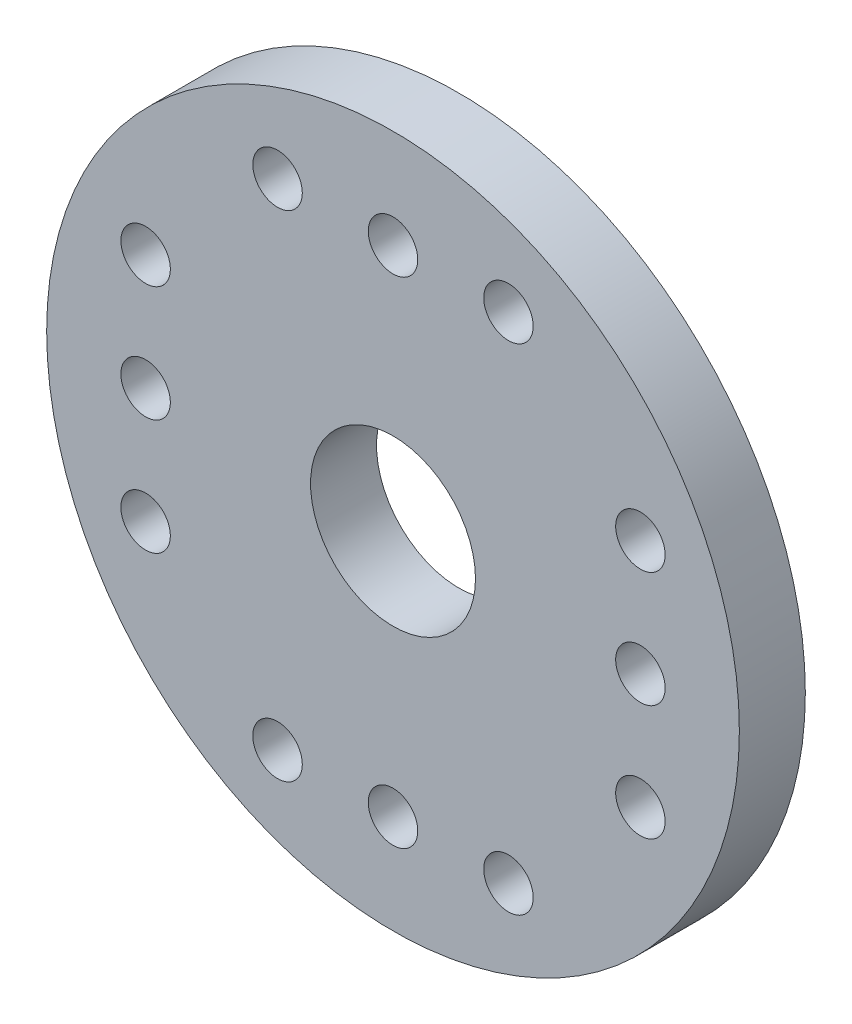
ISO-10303-21;
HEADER;
FILE_DESCRIPTION(('STEP AP214'),'2;1');
FILE_NAME('part.step','',(''),(''),'','','');
FILE_SCHEMA(('AUTOMOTIVE_DESIGN { 1 0 10303 214 1 1 1 1 }'));
ENDSEC;
DATA;
#1=APPLICATION_CONTEXT('core data for automotive mechanical design processes');
#2=APPLICATION_PROTOCOL_DEFINITION('international standard','automotive_design',2000,#1);
#3=PRODUCT_CONTEXT('',#1,'mechanical');
#4=PRODUCT('Part','Part','',(#3));
#5=PRODUCT_RELATED_PRODUCT_CATEGORY('part','',(#4));
#6=PRODUCT_DEFINITION_FORMATION('','',#4);
#7=PRODUCT_DEFINITION_CONTEXT('part definition',#1,'design');
#8=PRODUCT_DEFINITION('design','',#6,#7);
#9=PRODUCT_DEFINITION_SHAPE('','',#8);
#10=(LENGTH_UNIT() NAMED_UNIT(*) SI_UNIT(.MILLI.,.METRE.));
#11=(NAMED_UNIT(*) PLANE_ANGLE_UNIT() SI_UNIT($,.RADIAN.));
#12=(NAMED_UNIT(*) SI_UNIT($,.STERADIAN.) SOLID_ANGLE_UNIT());
#13=UNCERTAINTY_MEASURE_WITH_UNIT(LENGTH_MEASURE(1.E-05),#10,'distance_accuracy_value','');
#14=(GEOMETRIC_REPRESENTATION_CONTEXT(3) GLOBAL_UNCERTAINTY_ASSIGNED_CONTEXT((#13)) GLOBAL_UNIT_ASSIGNED_CONTEXT((#10,
#11,#12)) REPRESENTATION_CONTEXT('',''));
#15=CARTESIAN_POINT('',(0.,0.,0.));
#16=DIRECTION('',(0.,0.,1.));
#17=DIRECTION('',(1.,0.,0.));
#18=AXIS2_PLACEMENT_3D('',#15,#16,#17);
#19=CARTESIAN_POINT('',(0.,0.,2.));
#20=DIRECTION('',(0.,0.,1.));
#21=DIRECTION('',(1.,0.,0.));
#22=AXIS2_PLACEMENT_3D('',#19,#20,#21);
#23=PLANE('',#22);
#24=CARTESIAN_POINT('',(-7.49999999999926,-3.50000000000054,2.));
#25=DIRECTION('',(0.,0.,1.));
#26=DIRECTION('',(1.,0.,0.));
#27=AXIS2_PLACEMENT_3D('',#24,#25,#26);
#28=CIRCLE('',#27,0.750000000000818);
#29=CARTESIAN_POINT('',(-6.74999999999844,-3.50000000000054,2.));
#30=VERTEX_POINT('',#29);
#31=EDGE_CURVE('E107',#30,#30,#28,.T.);
#32=ORIENTED_EDGE('',*,*,#31,.F.);
#33=EDGE_LOOP('',(#32));
#34=FACE_BOUND('',#33,.T.);
#35=CARTESIAN_POINT('',(-3.49999999999872,-7.4999999999998,2.));
#36=DIRECTION('',(0.,0.,1.));
#37=DIRECTION('',(1.,0.,0.));
#38=AXIS2_PLACEMENT_3D('',#35,#36,#37);
#39=CIRCLE('',#38,0.750000000001322);
#40=CARTESIAN_POINT('',(-2.7499999999974,-7.4999999999998,2.));
#41=VERTEX_POINT('',#40);
#42=EDGE_CURVE('E95',#41,#41,#39,.T.);
#43=ORIENTED_EDGE('',*,*,#42,.F.);
#44=EDGE_LOOP('',(#43));
#45=FACE_BOUND('',#44,.T.);
#46=CARTESIAN_POINT('',(1.27714004517142E-12,-7.4999999999998,2.));
#47=DIRECTION('',(0.,0.,1.));
#48=DIRECTION('',(1.,0.,0.));
#49=AXIS2_PLACEMENT_3D('',#46,#47,#48);
#50=CIRCLE('',#49,0.750000000001329);
#51=CARTESIAN_POINT('',(0.750000000002606,-7.4999999999998,2.));
#52=VERTEX_POINT('',#51);
#53=EDGE_CURVE('E83',#52,#52,#50,.T.);
#54=ORIENTED_EDGE('',*,*,#53,.F.);
#55=EDGE_LOOP('',(#54));
#56=FACE_BOUND('',#55,.T.);
#57=CARTESIAN_POINT('',(7.50000000000054,3.50000000000074,2.));
#58=DIRECTION('',(0.,0.,1.));
#59=DIRECTION('',(1.,0.,0.));
#60=AXIS2_PLACEMENT_3D('',#57,#58,#59);
#61=CIRCLE('',#60,0.750000000000576);
#62=CARTESIAN_POINT('',(8.25000000000111,3.50000000000074,2.));
#63=VERTEX_POINT('',#62);
#64=EDGE_CURVE('E71',#63,#63,#61,.T.);
#65=ORIENTED_EDGE('',*,*,#64,.F.);
#66=EDGE_LOOP('',(#65));
#67=FACE_BOUND('',#66,.T.);
#68=CARTESIAN_POINT('',(0.,0.,2.));
#69=DIRECTION('',(0.,0.,1.));
#70=DIRECTION('',(1.,0.,0.));
#71=AXIS2_PLACEMENT_3D('',#68,#69,#70);
#72=CIRCLE('',#71,2.5);
#73=CARTESIAN_POINT('',(2.5,0.,2.));
#74=VERTEX_POINT('',#73);
#75=EDGE_CURVE('E59',#74,#74,#72,.T.);
#76=ORIENTED_EDGE('',*,*,#75,.F.);
#77=EDGE_LOOP('',(#76));
#78=FACE_BOUND('',#77,.T.);
#79=CARTESIAN_POINT('',(-3.5,7.5,2.));
#80=DIRECTION('',(0.,0.,1.));
#81=DIRECTION('',(1.,0.,0.));
#82=AXIS2_PLACEMENT_3D('',#79,#80,#81);
#83=CIRCLE('',#82,0.75);
#84=CARTESIAN_POINT('',(-2.75,7.5,2.));
#85=VERTEX_POINT('',#84);
#86=EDGE_CURVE('E47',#85,#85,#83,.T.);
#87=ORIENTED_EDGE('',*,*,#86,.F.);
#88=EDGE_LOOP('',(#87));
#89=FACE_BOUND('',#88,.T.);
#90=CARTESIAN_POINT('',(0.,0.,2.));
#91=DIRECTION('',(0.,0.,1.));
#92=DIRECTION('',(1.,0.,0.));
#93=AXIS2_PLACEMENT_3D('',#90,#91,#92);
#94=CIRCLE('',#93,10.5);
#95=CARTESIAN_POINT('',(10.5,0.,2.));
#96=VERTEX_POINT('',#95);
#97=EDGE_CURVE('E10',#96,#96,#94,.T.);
#98=ORIENTED_EDGE('',*,*,#97,.T.);
#99=EDGE_LOOP('',(#98));
#100=FACE_BOUND('',#99,.T.);
#101=CARTESIAN_POINT('',(0.,7.5,2.));
#102=DIRECTION('',(0.,0.,1.));
#103=DIRECTION('',(1.,0.,0.));
#104=AXIS2_PLACEMENT_3D('',#101,#102,#103);
#105=CIRCLE('',#104,0.75);
#106=CARTESIAN_POINT('',(0.75,7.5,2.));
#107=VERTEX_POINT('',#106);
#108=EDGE_CURVE('E42',#107,#107,#105,.T.);
#109=ORIENTED_EDGE('',*,*,#108,.F.);
#110=EDGE_LOOP('',(#109));
#111=FACE_BOUND('',#110,.T.);
#112=CARTESIAN_POINT('',(3.5,7.5,2.));
#113=DIRECTION('',(0.,0.,1.));
#114=DIRECTION('',(1.,0.,0.));
#115=AXIS2_PLACEMENT_3D('',#112,#113,#114);
#116=CIRCLE('',#115,0.75);
#117=CARTESIAN_POINT('',(4.25,7.5,2.));
#118=VERTEX_POINT('',#117);
#119=EDGE_CURVE('E53',#118,#118,#116,.T.);
#120=ORIENTED_EDGE('',*,*,#119,.F.);
#121=EDGE_LOOP('',(#120));
#122=FACE_BOUND('',#121,.T.);
#123=CARTESIAN_POINT('',(7.50000000000054,7.3744926071639E-13,2.));
#124=DIRECTION('',(0.,0.,1.));
#125=DIRECTION('',(1.,0.,0.));
#126=AXIS2_PLACEMENT_3D('',#123,#124,#125);
#127=CIRCLE('',#126,0.750000000000573);
#128=CARTESIAN_POINT('',(8.25000000000111,7.3744926071639E-13,2.));
#129=VERTEX_POINT('',#128);
#130=EDGE_CURVE('E65',#129,#129,#127,.T.);
#131=ORIENTED_EDGE('',*,*,#130,.F.);
#132=EDGE_LOOP('',(#131));
#133=FACE_BOUND('',#132,.T.);
#134=CARTESIAN_POINT('',(7.50000000000054,-3.49999999999926,2.));
#135=DIRECTION('',(0.,0.,1.));
#136=DIRECTION('',(1.,0.,0.));
#137=AXIS2_PLACEMENT_3D('',#134,#135,#136);
#138=CIRCLE('',#137,0.750000000000569);
#139=CARTESIAN_POINT('',(8.25000000000111,-3.49999999999926,2.));
#140=VERTEX_POINT('',#139);
#141=EDGE_CURVE('E77',#140,#140,#138,.T.);
#142=ORIENTED_EDGE('',*,*,#141,.F.);
#143=EDGE_LOOP('',(#142));
#144=FACE_BOUND('',#143,.T.);
#145=CARTESIAN_POINT('',(3.50000000000128,-7.4999999999998,2.));
#146=DIRECTION('',(0.,0.,1.));
#147=DIRECTION('',(1.,0.,0.));
#148=AXIS2_PLACEMENT_3D('',#145,#146,#147);
#149=CIRCLE('',#148,0.750000000001336);
#150=CARTESIAN_POINT('',(4.25000000000261,-7.4999999999998,2.));
#151=VERTEX_POINT('',#150);
#152=EDGE_CURVE('E89',#151,#151,#149,.T.);
#153=ORIENTED_EDGE('',*,*,#152,.F.);
#154=EDGE_LOOP('',(#153));
#155=FACE_BOUND('',#154,.T.);
#156=CARTESIAN_POINT('',(-7.49999999999926,-5.40609269554394E-13,2.));
#157=DIRECTION('',(0.,0.,1.));
#158=DIRECTION('',(1.,0.,0.));
#159=AXIS2_PLACEMENT_3D('',#156,#157,#158);
#160=CIRCLE('',#159,0.750000000000808);
#161=CARTESIAN_POINT('',(-6.74999999999846,-5.40609269554394E-13,2.));
#162=VERTEX_POINT('',#161);
#163=EDGE_CURVE('E101',#162,#162,#160,.T.);
#164=ORIENTED_EDGE('',*,*,#163,.F.);
#165=EDGE_LOOP('',(#164));
#166=FACE_BOUND('',#165,.T.);
#167=CARTESIAN_POINT('',(-7.49999999999926,3.49999999999946,2.));
#168=DIRECTION('',(0.,0.,1.));
#169=DIRECTION('',(1.,0.,0.));
#170=AXIS2_PLACEMENT_3D('',#167,#168,#169);
#171=CIRCLE('',#170,0.750000000000797);
#172=CARTESIAN_POINT('',(-6.74999999999847,3.49999999999946,2.));
#173=VERTEX_POINT('',#172);
#174=EDGE_CURVE('E113',#173,#173,#171,.T.);
#175=ORIENTED_EDGE('',*,*,#174,.F.);
#176=EDGE_LOOP('',(#175));
#177=FACE_BOUND('',#176,.T.);
#178=ADVANCED_FACE('F31',(#34,#45,#56,#67,#78,#89,#100,#111,#122,#133,#144,#155,#166,#177),#23,.T.);
#179=CARTESIAN_POINT('',(0.,0.,0.));
#180=DIRECTION('',(0.,0.,1.));
#181=DIRECTION('',(1.,0.,0.));
#182=AXIS2_PLACEMENT_3D('',#179,#180,#181);
#183=PLANE('',#182);
#184=CARTESIAN_POINT('',(-7.49999999999926,-3.50000000000054,0.));
#185=DIRECTION('',(0.,0.,1.));
#186=DIRECTION('',(1.,0.,0.));
#187=AXIS2_PLACEMENT_3D('',#184,#185,#186);
#188=CIRCLE('',#187,0.750000000000818);
#189=CARTESIAN_POINT('',(-6.74999999999844,-3.50000000000054,0.));
#190=VERTEX_POINT('',#189);
#191=EDGE_CURVE('E110',#190,#190,#188,.T.);
#192=ORIENTED_EDGE('',*,*,#191,.T.);
#193=EDGE_LOOP('',(#192));
#194=FACE_BOUND('',#193,.T.);
#195=CARTESIAN_POINT('',(-3.49999999999872,-7.4999999999998,0.));
#196=DIRECTION('',(0.,0.,1.));
#197=DIRECTION('',(1.,0.,0.));
#198=AXIS2_PLACEMENT_3D('',#195,#196,#197);
#199=CIRCLE('',#198,0.750000000001322);
#200=CARTESIAN_POINT('',(-2.7499999999974,-7.4999999999998,0.));
#201=VERTEX_POINT('',#200);
#202=EDGE_CURVE('E98',#201,#201,#199,.T.);
#203=ORIENTED_EDGE('',*,*,#202,.T.);
#204=EDGE_LOOP('',(#203));
#205=FACE_BOUND('',#204,.T.);
#206=CARTESIAN_POINT('',(1.27714004517142E-12,-7.4999999999998,0.));
#207=DIRECTION('',(0.,0.,1.));
#208=DIRECTION('',(1.,0.,0.));
#209=AXIS2_PLACEMENT_3D('',#206,#207,#208);
#210=CIRCLE('',#209,0.750000000001329);
#211=CARTESIAN_POINT('',(0.750000000002606,-7.4999999999998,0.));
#212=VERTEX_POINT('',#211);
#213=EDGE_CURVE('E86',#212,#212,#210,.T.);
#214=ORIENTED_EDGE('',*,*,#213,.T.);
#215=EDGE_LOOP('',(#214));
#216=FACE_BOUND('',#215,.T.);
#217=CARTESIAN_POINT('',(7.50000000000054,3.50000000000074,0.));
#218=DIRECTION('',(0.,0.,1.));
#219=DIRECTION('',(1.,0.,0.));
#220=AXIS2_PLACEMENT_3D('',#217,#218,#219);
#221=CIRCLE('',#220,0.750000000000576);
#222=CARTESIAN_POINT('',(8.25000000000111,3.50000000000074,0.));
#223=VERTEX_POINT('',#222);
#224=EDGE_CURVE('E74',#223,#223,#221,.T.);
#225=ORIENTED_EDGE('',*,*,#224,.T.);
#226=EDGE_LOOP('',(#225));
#227=FACE_BOUND('',#226,.T.);
#228=CARTESIAN_POINT('',(0.,0.,0.));
#229=DIRECTION('',(0.,0.,1.));
#230=DIRECTION('',(1.,0.,0.));
#231=AXIS2_PLACEMENT_3D('',#228,#229,#230);
#232=CIRCLE('',#231,2.5);
#233=CARTESIAN_POINT('',(2.5,0.,0.));
#234=VERTEX_POINT('',#233);
#235=EDGE_CURVE('E62',#234,#234,#232,.T.);
#236=ORIENTED_EDGE('',*,*,#235,.T.);
#237=EDGE_LOOP('',(#236));
#238=FACE_BOUND('',#237,.T.);
#239=CARTESIAN_POINT('',(-3.5,7.5,0.));
#240=DIRECTION('',(0.,0.,1.));
#241=DIRECTION('',(1.,0.,0.));
#242=AXIS2_PLACEMENT_3D('',#239,#240,#241);
#243=CIRCLE('',#242,0.75);
#244=CARTESIAN_POINT('',(-2.75,7.5,0.));
#245=VERTEX_POINT('',#244);
#246=EDGE_CURVE('E50',#245,#245,#243,.T.);
#247=ORIENTED_EDGE('',*,*,#246,.T.);
#248=EDGE_LOOP('',(#247));
#249=FACE_BOUND('',#248,.T.);
#250=CARTESIAN_POINT('',(0.,0.,0.));
#251=DIRECTION('',(0.,0.,1.));
#252=DIRECTION('',(1.,0.,0.));
#253=AXIS2_PLACEMENT_3D('',#250,#251,#252);
#254=CIRCLE('',#253,10.5);
#255=CARTESIAN_POINT('',(10.5,0.,0.));
#256=VERTEX_POINT('',#255);
#257=EDGE_CURVE('E35',#256,#256,#254,.T.);
#258=ORIENTED_EDGE('',*,*,#257,.F.);
#259=EDGE_LOOP('',(#258));
#260=FACE_BOUND('',#259,.T.);
#261=CARTESIAN_POINT('',(0.,7.5,0.));
#262=DIRECTION('',(0.,0.,1.));
#263=DIRECTION('',(1.,0.,0.));
#264=AXIS2_PLACEMENT_3D('',#261,#262,#263);
#265=CIRCLE('',#264,0.75);
#266=CARTESIAN_POINT('',(0.75,7.5,0.));
#267=VERTEX_POINT('',#266);
#268=EDGE_CURVE('E44',#267,#267,#265,.T.);
#269=ORIENTED_EDGE('',*,*,#268,.T.);
#270=EDGE_LOOP('',(#269));
#271=FACE_BOUND('',#270,.T.);
#272=CARTESIAN_POINT('',(3.5,7.5,0.));
#273=DIRECTION('',(0.,0.,1.));
#274=DIRECTION('',(1.,0.,0.));
#275=AXIS2_PLACEMENT_3D('',#272,#273,#274);
#276=CIRCLE('',#275,0.75);
#277=CARTESIAN_POINT('',(4.25,7.5,0.));
#278=VERTEX_POINT('',#277);
#279=EDGE_CURVE('E56',#278,#278,#276,.T.);
#280=ORIENTED_EDGE('',*,*,#279,.T.);
#281=EDGE_LOOP('',(#280));
#282=FACE_BOUND('',#281,.T.);
#283=CARTESIAN_POINT('',(7.50000000000054,7.3744926071639E-13,0.));
#284=DIRECTION('',(0.,0.,1.));
#285=DIRECTION('',(1.,0.,0.));
#286=AXIS2_PLACEMENT_3D('',#283,#284,#285);
#287=CIRCLE('',#286,0.750000000000573);
#288=CARTESIAN_POINT('',(8.25000000000111,7.3744926071639E-13,0.));
#289=VERTEX_POINT('',#288);
#290=EDGE_CURVE('E68',#289,#289,#287,.T.);
#291=ORIENTED_EDGE('',*,*,#290,.T.);
#292=EDGE_LOOP('',(#291));
#293=FACE_BOUND('',#292,.T.);
#294=CARTESIAN_POINT('',(7.50000000000054,-3.49999999999926,0.));
#295=DIRECTION('',(0.,0.,1.));
#296=DIRECTION('',(1.,0.,0.));
#297=AXIS2_PLACEMENT_3D('',#294,#295,#296);
#298=CIRCLE('',#297,0.750000000000569);
#299=CARTESIAN_POINT('',(8.25000000000111,-3.49999999999926,0.));
#300=VERTEX_POINT('',#299);
#301=EDGE_CURVE('E80',#300,#300,#298,.T.);
#302=ORIENTED_EDGE('',*,*,#301,.T.);
#303=EDGE_LOOP('',(#302));
#304=FACE_BOUND('',#303,.T.);
#305=CARTESIAN_POINT('',(3.50000000000128,-7.4999999999998,0.));
#306=DIRECTION('',(0.,0.,1.));
#307=DIRECTION('',(1.,0.,0.));
#308=AXIS2_PLACEMENT_3D('',#305,#306,#307);
#309=CIRCLE('',#308,0.750000000001336);
#310=CARTESIAN_POINT('',(4.25000000000261,-7.4999999999998,0.));
#311=VERTEX_POINT('',#310);
#312=EDGE_CURVE('E92',#311,#311,#309,.T.);
#313=ORIENTED_EDGE('',*,*,#312,.T.);
#314=EDGE_LOOP('',(#313));
#315=FACE_BOUND('',#314,.T.);
#316=CARTESIAN_POINT('',(-7.49999999999926,-5.40609269554394E-13,0.));
#317=DIRECTION('',(0.,0.,1.));
#318=DIRECTION('',(1.,0.,0.));
#319=AXIS2_PLACEMENT_3D('',#316,#317,#318);
#320=CIRCLE('',#319,0.750000000000808);
#321=CARTESIAN_POINT('',(-6.74999999999846,-5.40609269554394E-13,0.));
#322=VERTEX_POINT('',#321);
#323=EDGE_CURVE('E104',#322,#322,#320,.T.);
#324=ORIENTED_EDGE('',*,*,#323,.T.);
#325=EDGE_LOOP('',(#324));
#326=FACE_BOUND('',#325,.T.);
#327=CARTESIAN_POINT('',(-7.49999999999926,3.49999999999946,0.));
#328=DIRECTION('',(0.,0.,1.));
#329=DIRECTION('',(1.,0.,0.));
#330=AXIS2_PLACEMENT_3D('',#327,#328,#329);
#331=CIRCLE('',#330,0.750000000000797);
#332=CARTESIAN_POINT('',(-6.74999999999847,3.49999999999946,0.));
#333=VERTEX_POINT('',#332);
#334=EDGE_CURVE('E116',#333,#333,#331,.T.);
#335=ORIENTED_EDGE('',*,*,#334,.T.);
#336=EDGE_LOOP('',(#335));
#337=FACE_BOUND('',#336,.T.);
#338=ADVANCED_FACE('F126',(#194,#205,#216,#227,#238,#249,#260,#271,#282,#293,#304,#315,#326,
#337),#183,.F.);
#339=CARTESIAN_POINT('',(0.,0.,2.));
#340=DIRECTION('',(0.,0.,-1.));
#341=DIRECTION('',(-1.,0.,0.));
#342=AXIS2_PLACEMENT_3D('',#339,#340,#341);
#343=CYLINDRICAL_SURFACE('',#342,10.5);
#344=ORIENTED_EDGE('',*,*,#97,.F.);
#345=EDGE_LOOP('',(#344));
#346=FACE_BOUND('',#345,.T.);
#347=ORIENTED_EDGE('',*,*,#257,.T.);
#348=EDGE_LOOP('',(#347));
#349=FACE_BOUND('',#348,.T.);
#350=ADVANCED_FACE('F33',(#346,#349),#343,.T.);
#351=CARTESIAN_POINT('',(0.,7.5,2.));
#352=DIRECTION('',(0.,0.,-1.));
#353=DIRECTION('',(-1.,0.,0.));
#354=AXIS2_PLACEMENT_3D('',#351,#352,#353);
#355=CYLINDRICAL_SURFACE('',#354,0.75);
#356=ORIENTED_EDGE('',*,*,#108,.T.);
#357=EDGE_LOOP('',(#356));
#358=FACE_BOUND('',#357,.T.);
#359=ORIENTED_EDGE('',*,*,#268,.F.);
#360=EDGE_LOOP('',(#359));
#361=FACE_BOUND('',#360,.T.);
#362=ADVANCED_FACE('F136',(#358,#361),#355,.F.);
#363=CARTESIAN_POINT('',(-3.5,7.5,2.));
#364=DIRECTION('',(0.,0.,-1.));
#365=DIRECTION('',(-1.,0.,0.));
#366=AXIS2_PLACEMENT_3D('',#363,#364,#365);
#367=CYLINDRICAL_SURFACE('',#366,0.75);
#368=ORIENTED_EDGE('',*,*,#86,.T.);
#369=EDGE_LOOP('',(#368));
#370=FACE_BOUND('',#369,.T.);
#371=ORIENTED_EDGE('',*,*,#246,.F.);
#372=EDGE_LOOP('',(#371));
#373=FACE_BOUND('',#372,.T.);
#374=ADVANCED_FACE('F139',(#370,#373),#367,.F.);
#375=CARTESIAN_POINT('',(3.5,7.5,2.));
#376=DIRECTION('',(0.,0.,-1.));
#377=DIRECTION('',(-1.,0.,0.));
#378=AXIS2_PLACEMENT_3D('',#375,#376,#377);
#379=CYLINDRICAL_SURFACE('',#378,0.75);
#380=ORIENTED_EDGE('',*,*,#119,.T.);
#381=EDGE_LOOP('',(#380));
#382=FACE_BOUND('',#381,.T.);
#383=ORIENTED_EDGE('',*,*,#279,.F.);
#384=EDGE_LOOP('',(#383));
#385=FACE_BOUND('',#384,.T.);
#386=ADVANCED_FACE('F143',(#382,#385),#379,.F.);
#387=CARTESIAN_POINT('',(0.,0.,2.));
#388=DIRECTION('',(0.,0.,-1.));
#389=DIRECTION('',(-1.,0.,0.));
#390=AXIS2_PLACEMENT_3D('',#387,#388,#389);
#391=CYLINDRICAL_SURFACE('',#390,2.5);
#392=ORIENTED_EDGE('',*,*,#75,.T.);
#393=EDGE_LOOP('',(#392));
#394=FACE_BOUND('',#393,.T.);
#395=ORIENTED_EDGE('',*,*,#235,.F.);
#396=EDGE_LOOP('',(#395));
#397=FACE_BOUND('',#396,.T.);
#398=ADVANCED_FACE('F147',(#394,#397),#391,.F.);
#399=CARTESIAN_POINT('',(7.50000000000054,7.3744926071639E-13,2.));
#400=DIRECTION('',(0.,0.,-1.));
#401=DIRECTION('',(-1.,0.,0.));
#402=AXIS2_PLACEMENT_3D('',#399,#400,#401);
#403=CYLINDRICAL_SURFACE('',#402,0.750000000000573);
#404=ORIENTED_EDGE('',*,*,#130,.T.);
#405=EDGE_LOOP('',(#404));
#406=FACE_BOUND('',#405,.T.);
#407=ORIENTED_EDGE('',*,*,#290,.F.);
#408=EDGE_LOOP('',(#407));
#409=FACE_BOUND('',#408,.T.);
#410=ADVANCED_FACE('F151',(#406,#409),#403,.F.);
#411=CARTESIAN_POINT('',(7.50000000000054,3.50000000000074,2.));
#412=DIRECTION('',(0.,0.,-1.));
#413=DIRECTION('',(-1.,0.,0.));
#414=AXIS2_PLACEMENT_3D('',#411,#412,#413);
#415=CYLINDRICAL_SURFACE('',#414,0.750000000000576);
#416=ORIENTED_EDGE('',*,*,#64,.T.);
#417=EDGE_LOOP('',(#416));
#418=FACE_BOUND('',#417,.T.);
#419=ORIENTED_EDGE('',*,*,#224,.F.);
#420=EDGE_LOOP('',(#419));
#421=FACE_BOUND('',#420,.T.);
#422=ADVANCED_FACE('F155',(#418,#421),#415,.F.);
#423=CARTESIAN_POINT('',(7.50000000000054,-3.49999999999926,2.));
#424=DIRECTION('',(0.,0.,-1.));
#425=DIRECTION('',(-1.,0.,0.));
#426=AXIS2_PLACEMENT_3D('',#423,#424,#425);
#427=CYLINDRICAL_SURFACE('',#426,0.750000000000569);
#428=ORIENTED_EDGE('',*,*,#141,.T.);
#429=EDGE_LOOP('',(#428));
#430=FACE_BOUND('',#429,.T.);
#431=ORIENTED_EDGE('',*,*,#301,.F.);
#432=EDGE_LOOP('',(#431));
#433=FACE_BOUND('',#432,.T.);
#434=ADVANCED_FACE('F159',(#430,#433),#427,.F.);
#435=CARTESIAN_POINT('',(1.27714004517142E-12,-7.4999999999998,2.));
#436=DIRECTION('',(0.,0.,-1.));
#437=DIRECTION('',(-1.,0.,0.));
#438=AXIS2_PLACEMENT_3D('',#435,#436,#437);
#439=CYLINDRICAL_SURFACE('',#438,0.750000000001329);
#440=ORIENTED_EDGE('',*,*,#53,.T.);
#441=EDGE_LOOP('',(#440));
#442=FACE_BOUND('',#441,.T.);
#443=ORIENTED_EDGE('',*,*,#213,.F.);
#444=EDGE_LOOP('',(#443));
#445=FACE_BOUND('',#444,.T.);
#446=ADVANCED_FACE('F163',(#442,#445),#439,.F.);
#447=CARTESIAN_POINT('',(3.50000000000128,-7.4999999999998,2.));
#448=DIRECTION('',(0.,0.,-1.));
#449=DIRECTION('',(-1.,0.,0.));
#450=AXIS2_PLACEMENT_3D('',#447,#448,#449);
#451=CYLINDRICAL_SURFACE('',#450,0.750000000001336);
#452=ORIENTED_EDGE('',*,*,#152,.T.);
#453=EDGE_LOOP('',(#452));
#454=FACE_BOUND('',#453,.T.);
#455=ORIENTED_EDGE('',*,*,#312,.F.);
#456=EDGE_LOOP('',(#455));
#457=FACE_BOUND('',#456,.T.);
#458=ADVANCED_FACE('F167',(#454,#457),#451,.F.);
#459=CARTESIAN_POINT('',(-3.49999999999872,-7.4999999999998,2.));
#460=DIRECTION('',(0.,0.,-1.));
#461=DIRECTION('',(-1.,0.,0.));
#462=AXIS2_PLACEMENT_3D('',#459,#460,#461);
#463=CYLINDRICAL_SURFACE('',#462,0.750000000001322);
#464=ORIENTED_EDGE('',*,*,#42,.T.);
#465=EDGE_LOOP('',(#464));
#466=FACE_BOUND('',#465,.T.);
#467=ORIENTED_EDGE('',*,*,#202,.F.);
#468=EDGE_LOOP('',(#467));
#469=FACE_BOUND('',#468,.T.);
#470=ADVANCED_FACE('F171',(#466,#469),#463,.F.);
#471=CARTESIAN_POINT('',(-7.49999999999926,-5.40609269554394E-13,2.));
#472=DIRECTION('',(0.,0.,-1.));
#473=DIRECTION('',(-1.,0.,0.));
#474=AXIS2_PLACEMENT_3D('',#471,#472,#473);
#475=CYLINDRICAL_SURFACE('',#474,0.750000000000808);
#476=ORIENTED_EDGE('',*,*,#163,.T.);
#477=EDGE_LOOP('',(#476));
#478=FACE_BOUND('',#477,.T.);
#479=ORIENTED_EDGE('',*,*,#323,.F.);
#480=EDGE_LOOP('',(#479));
#481=FACE_BOUND('',#480,.T.);
#482=ADVANCED_FACE('F175',(#478,#481),#475,.F.);
#483=CARTESIAN_POINT('',(-7.49999999999926,-3.50000000000054,2.));
#484=DIRECTION('',(0.,0.,-1.));
#485=DIRECTION('',(-1.,0.,0.));
#486=AXIS2_PLACEMENT_3D('',#483,#484,#485);
#487=CYLINDRICAL_SURFACE('',#486,0.750000000000818);
#488=ORIENTED_EDGE('',*,*,#31,.T.);
#489=EDGE_LOOP('',(#488));
#490=FACE_BOUND('',#489,.T.);
#491=ORIENTED_EDGE('',*,*,#191,.F.);
#492=EDGE_LOOP('',(#491));
#493=FACE_BOUND('',#492,.T.);
#494=ADVANCED_FACE('F179',(#490,#493),#487,.F.);
#495=CARTESIAN_POINT('',(-7.49999999999926,3.49999999999946,2.));
#496=DIRECTION('',(0.,0.,-1.));
#497=DIRECTION('',(-1.,0.,0.));
#498=AXIS2_PLACEMENT_3D('',#495,#496,#497);
#499=CYLINDRICAL_SURFACE('',#498,0.750000000000797);
#500=ORIENTED_EDGE('',*,*,#174,.T.);
#501=EDGE_LOOP('',(#500));
#502=FACE_BOUND('',#501,.T.);
#503=ORIENTED_EDGE('',*,*,#334,.F.);
#504=EDGE_LOOP('',(#503));
#505=FACE_BOUND('',#504,.T.);
#506=ADVANCED_FACE('F122',(#502,#505),#499,.F.);
#507=CLOSED_SHELL('',(#178,#338,#350,#362,#374,#386,#398,#410,#422,#434,#446,#458,#470,#482,
#494,#506));
#508=MANIFOLD_SOLID_BREP('B2',#507);
#509=ADVANCED_BREP_SHAPE_REPRESENTATION('',(#18,#508),#14);
#510=SHAPE_DEFINITION_REPRESENTATION(#9,#509);
ENDSEC;
END-ISO-10303-21;
